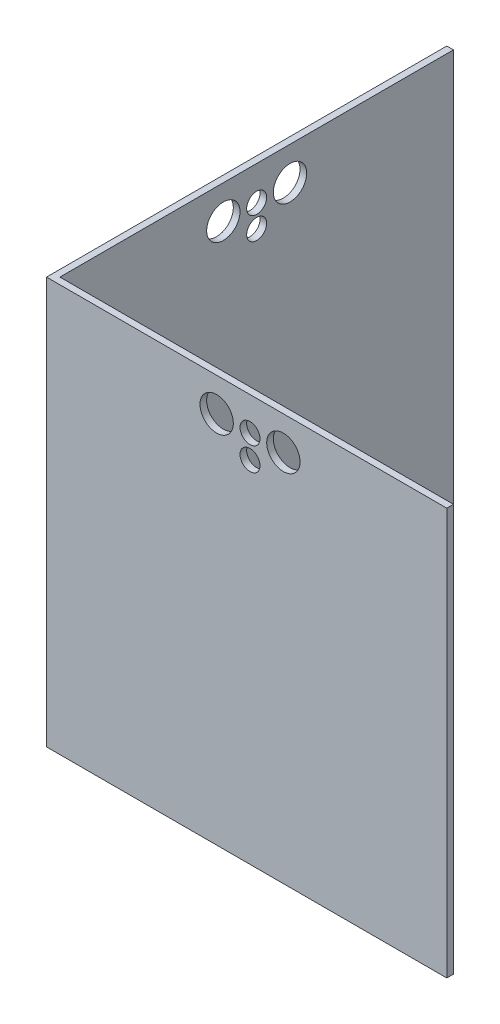
ISO-10303-21;
HEADER;
FILE_DESCRIPTION(('STEP AP214'),'2;1');
FILE_NAME('part.step','',(''),(''),'','','');
FILE_SCHEMA(('AUTOMOTIVE_DESIGN { 1 0 10303 214 1 1 1 1 }'));
ENDSEC;
DATA;
#1=APPLICATION_CONTEXT('core data for automotive mechanical design processes');
#2=APPLICATION_PROTOCOL_DEFINITION('international standard','automotive_design',2000,#1);
#3=PRODUCT_CONTEXT('',#1,'mechanical');
#4=PRODUCT('Part','Part','',(#3));
#5=PRODUCT_RELATED_PRODUCT_CATEGORY('part','',(#4));
#6=PRODUCT_DEFINITION_FORMATION('','',#4);
#7=PRODUCT_DEFINITION_CONTEXT('part definition',#1,'design');
#8=PRODUCT_DEFINITION('design','',#6,#7);
#9=PRODUCT_DEFINITION_SHAPE('','',#8);
#10=(LENGTH_UNIT() NAMED_UNIT(*) SI_UNIT(.MILLI.,.METRE.));
#11=(NAMED_UNIT(*) PLANE_ANGLE_UNIT() SI_UNIT($,.RADIAN.));
#12=(NAMED_UNIT(*) SI_UNIT($,.STERADIAN.) SOLID_ANGLE_UNIT());
#13=UNCERTAINTY_MEASURE_WITH_UNIT(LENGTH_MEASURE(1.E-05),#10,'distance_accuracy_value','');
#14=(GEOMETRIC_REPRESENTATION_CONTEXT(3) GLOBAL_UNCERTAINTY_ASSIGNED_CONTEXT((#13)) GLOBAL_UNIT_ASSIGNED_CONTEXT((#10,
#11,#12)) REPRESENTATION_CONTEXT('',''));
#15=CARTESIAN_POINT('',(0.,0.,0.));
#16=DIRECTION('',(0.,0.,1.));
#17=DIRECTION('',(1.,0.,0.));
#18=AXIS2_PLACEMENT_3D('',#15,#16,#17);
#19=CARTESIAN_POINT('',(-71.6450963275028,2.,-99.585522077645));
#20=DIRECTION('',(0.,0.,1.));
#21=DIRECTION('',(1.,0.,0.));
#22=AXIS2_PLACEMENT_3D('',#19,#20,#21);
#23=PLANE('',#22);
#24=DIRECTION('',(-1.,0.,0.));
#25=VECTOR('',#24,1.);
#26=CARTESIAN_POINT('',(-71.6450963275028,0.,-99.585522077645));
#27=LINE('',#26,#25);
#28=CARTESIAN_POINT('',(-69.6450963275028,0.,-99.585522077645));
#29=VERTEX_POINT('',#28);
#30=CARTESIAN_POINT('',(-71.6450963275028,0.,-99.585522077645));
#31=VERTEX_POINT('',#30);
#32=EDGE_CURVE('E125',#29,#31,#27,.T.);
#33=ORIENTED_EDGE('',*,*,#32,.T.);
#34=DIRECTION('',(0.,-1.,0.));
#35=VECTOR('',#34,1.);
#36=CARTESIAN_POINT('',(-71.6450963275028,2.,-99.585522077645));
#37=LINE('',#36,#35);
#38=CARTESIAN_POINT('',(-71.6450963275028,122.,-99.585522077645));
#39=VERTEX_POINT('',#38);
#40=EDGE_CURVE('E11',#39,#31,#37,.T.);
#41=ORIENTED_EDGE('',*,*,#40,.F.);
#42=DIRECTION('',(-1.,0.,0.));
#43=VECTOR('',#42,1.);
#44=CARTESIAN_POINT('',(-71.6450963275028,122.,-99.585522077645));
#45=LINE('',#44,#43);
#46=CARTESIAN_POINT('',(-69.6450963275028,122.,-99.585522077645));
#47=VERTEX_POINT('',#46);
#48=EDGE_CURVE('E123',#47,#39,#45,.T.);
#49=ORIENTED_EDGE('',*,*,#48,.F.);
#50=DIRECTION('',(0.,-1.,0.));
#51=VECTOR('',#50,1.);
#52=CARTESIAN_POINT('',(-69.6450963275028,122.,-99.585522077645));
#53=LINE('',#52,#51);
#54=CARTESIAN_POINT('',(-69.6450963275028,2.,-99.585522077645));
#55=VERTEX_POINT('',#54);
#56=EDGE_CURVE('E154',#47,#55,#53,.T.);
#57=ORIENTED_EDGE('',*,*,#56,.T.);
#58=DIRECTION('',(0.,-1.,0.));
#59=VECTOR('',#58,1.);
#60=CARTESIAN_POINT('',(-69.6450963275028,2.,-99.585522077645));
#61=LINE('',#60,#59);
#62=EDGE_CURVE('E169',#55,#29,#61,.T.);
#63=ORIENTED_EDGE('',*,*,#62,.T.);
#64=EDGE_LOOP('',(#33,#41,#49,#57,#63));
#65=FACE_BOUND('',#64,.T.);
#66=ADVANCED_FACE('F41',(#65),#23,.F.);
#67=CARTESIAN_POINT('',(-71.6450963275028,2.,-99.585522077645));
#68=DIRECTION('',(1.,0.,0.));
#69=DIRECTION('',(0.,0.,-1.));
#70=AXIS2_PLACEMENT_3D('',#67,#68,#69);
#71=PLANE('',#70);
#72=CARTESIAN_POINT('',(-71.6450963275028,112.,-30.585522077645));
#73=DIRECTION('',(1.,0.,0.));
#74=DIRECTION('',(0.,0.,-1.));
#75=AXIS2_PLACEMENT_3D('',#72,#73,#74);
#76=CIRCLE('',#75,5.);
#77=CARTESIAN_POINT('',(-71.6450963275028,112.,-35.585522077645));
#78=VERTEX_POINT('',#77);
#79=EDGE_CURVE('E413',#78,#78,#76,.T.);
#80=ORIENTED_EDGE('',*,*,#79,.T.);
#81=EDGE_LOOP('',(#80));
#82=FACE_BOUND('',#81,.T.);
#83=CARTESIAN_POINT('',(-71.6450963275028,112.,-50.585522077645));
#84=DIRECTION('',(1.,0.,0.));
#85=DIRECTION('',(0.,0.,-1.));
#86=AXIS2_PLACEMENT_3D('',#83,#84,#85);
#87=CIRCLE('',#86,5.);
#88=CARTESIAN_POINT('',(-71.6450963275028,112.,-55.585522077645));
#89=VERTEX_POINT('',#88);
#90=EDGE_CURVE('E406',#89,#89,#87,.T.);
#91=ORIENTED_EDGE('',*,*,#90,.T.);
#92=EDGE_LOOP('',(#91));
#93=FACE_BOUND('',#92,.T.);
#94=CARTESIAN_POINT('',(-71.6450963275028,104.992052500628,-40.585522077645));
#95=DIRECTION('',(1.,0.,0.));
#96=DIRECTION('',(0.,0.,-1.));
#97=AXIS2_PLACEMENT_3D('',#94,#95,#96);
#98=CIRCLE('',#97,3.);
#99=CARTESIAN_POINT('',(-71.6450963275028,104.992052500628,-43.585522077645));
#100=VERTEX_POINT('',#99);
#101=EDGE_CURVE('E400',#100,#100,#98,.T.);
#102=ORIENTED_EDGE('',*,*,#101,.T.);
#103=EDGE_LOOP('',(#102));
#104=FACE_BOUND('',#103,.T.);
#105=CARTESIAN_POINT('',(-71.6450963275028,111.785381459401,-40.585522077645));
#106=DIRECTION('',(1.,0.,0.));
#107=DIRECTION('',(0.,0.,-1.));
#108=AXIS2_PLACEMENT_3D('',#105,#106,#107);
#109=CIRCLE('',#108,3.);
#110=CARTESIAN_POINT('',(-71.6450963275028,111.785381459401,-43.585522077645));
#111=VERTEX_POINT('',#110);
#112=EDGE_CURVE('E420',#111,#111,#109,.T.);
#113=ORIENTED_EDGE('',*,*,#112,.T.);
#114=EDGE_LOOP('',(#113));
#115=FACE_BOUND('',#114,.T.);
#116=DIRECTION('',(0.,0.,1.));
#117=VECTOR('',#116,1.);
#118=CARTESIAN_POINT('',(-71.6450963275028,0.,-99.585522077645));
#119=LINE('',#118,#117);
#120=CARTESIAN_POINT('',(-71.6450963275028,0.,20.414477922355));
#121=VERTEX_POINT('',#120);
#122=EDGE_CURVE('E171',#31,#121,#119,.T.);
#123=ORIENTED_EDGE('',*,*,#122,.T.);
#124=DIRECTION('',(0.,-1.,0.));
#125=VECTOR('',#124,1.);
#126=CARTESIAN_POINT('',(-71.6450963275028,2.,20.414477922355));
#127=LINE('',#126,#125);
#128=CARTESIAN_POINT('',(-71.6450963275028,122.,20.414477922355));
#129=VERTEX_POINT('',#128);
#130=EDGE_CURVE('E49',#129,#121,#127,.T.);
#131=ORIENTED_EDGE('',*,*,#130,.F.);
#132=DIRECTION('',(0.,0.,1.));
#133=VECTOR('',#132,1.);
#134=CARTESIAN_POINT('',(-71.6450963275028,122.,20.414477922355));
#135=LINE('',#134,#133);
#136=EDGE_CURVE('E128',#39,#129,#135,.T.);
#137=ORIENTED_EDGE('',*,*,#136,.F.);
#138=ORIENTED_EDGE('',*,*,#40,.T.);
#139=EDGE_LOOP('',(#123,#131,#137,#138));
#140=FACE_BOUND('',#139,.T.);
#141=ADVANCED_FACE('F129',(#82,#93,#104,#115,#140),#71,.F.);
#142=CARTESIAN_POINT('',(-71.6450963275028,2.,20.414477922355));
#143=DIRECTION('',(0.,0.,-1.));
#144=DIRECTION('',(-1.,0.,0.));
#145=AXIS2_PLACEMENT_3D('',#142,#143,#144);
#146=PLANE('',#145);
#147=CARTESIAN_POINT('',(-10.6450963275028,105.,20.414477922355));
#148=DIRECTION('',(0.,0.,-1.));
#149=DIRECTION('',(-1.,0.,0.));
#150=AXIS2_PLACEMENT_3D('',#147,#148,#149);
#151=CIRCLE('',#150,3.);
#152=CARTESIAN_POINT('',(-13.6450963275028,105.,20.414477922355));
#153=VERTEX_POINT('',#152);
#154=EDGE_CURVE('E395',#153,#153,#151,.T.);
#155=ORIENTED_EDGE('',*,*,#154,.T.);
#156=EDGE_LOOP('',(#155));
#157=FACE_BOUND('',#156,.T.);
#158=CARTESIAN_POINT('',(-0.64509632750281,112.,20.414477922355));
#159=DIRECTION('',(0.,0.,-1.));
#160=DIRECTION('',(-1.,0.,0.));
#161=AXIS2_PLACEMENT_3D('',#158,#159,#160);
#162=CIRCLE('',#161,5.);
#163=CARTESIAN_POINT('',(-5.64509632750281,112.,20.414477922355));
#164=VERTEX_POINT('',#163);
#165=EDGE_CURVE('E155',#164,#164,#162,.T.);
#166=ORIENTED_EDGE('',*,*,#165,.T.);
#167=EDGE_LOOP('',(#166));
#168=FACE_BOUND('',#167,.T.);
#169=CARTESIAN_POINT('',(-20.6450963275028,112.,20.414477922355));
#170=DIRECTION('',(0.,0.,-1.));
#171=DIRECTION('',(-1.,0.,0.));
#172=AXIS2_PLACEMENT_3D('',#169,#170,#171);
#173=CIRCLE('',#172,5.);
#174=CARTESIAN_POINT('',(-25.6450963275028,112.,20.414477922355));
#175=VERTEX_POINT('',#174);
#176=EDGE_CURVE('E433',#175,#175,#173,.T.);
#177=ORIENTED_EDGE('',*,*,#176,.T.);
#178=EDGE_LOOP('',(#177));
#179=FACE_BOUND('',#178,.T.);
#180=CARTESIAN_POINT('',(-10.6450963275028,112.,20.414477922355));
#181=DIRECTION('',(0.,0.,-1.));
#182=DIRECTION('',(-1.,0.,0.));
#183=AXIS2_PLACEMENT_3D('',#180,#181,#182);
#184=CIRCLE('',#183,3.);
#185=CARTESIAN_POINT('',(-13.6450963275028,112.,20.414477922355));
#186=VERTEX_POINT('',#185);
#187=EDGE_CURVE('E145',#186,#186,#184,.T.);
#188=ORIENTED_EDGE('',*,*,#187,.T.);
#189=EDGE_LOOP('',(#188));
#190=FACE_BOUND('',#189,.T.);
#191=DIRECTION('',(1.,0.,0.));
#192=VECTOR('',#191,1.);
#193=CARTESIAN_POINT('',(-71.6450963275028,0.,20.414477922355));
#194=LINE('',#193,#192);
#195=CARTESIAN_POINT('',(48.3549036724972,0.,20.414477922355));
#196=VERTEX_POINT('',#195);
#197=EDGE_CURVE('E173',#121,#196,#194,.T.);
#198=ORIENTED_EDGE('',*,*,#197,.T.);
#199=DIRECTION('',(0.,-1.,0.));
#200=VECTOR('',#199,1.);
#201=CARTESIAN_POINT('',(48.3549036724972,2.,20.414477922355));
#202=LINE('',#201,#200);
#203=CARTESIAN_POINT('',(48.3549036724972,122.,20.414477922355));
#204=VERTEX_POINT('',#203);
#205=EDGE_CURVE('E189',#204,#196,#202,.T.);
#206=ORIENTED_EDGE('',*,*,#205,.F.);
#207=DIRECTION('',(1.,0.,0.));
#208=VECTOR('',#207,1.);
#209=CARTESIAN_POINT('',(48.3549036724972,122.,20.414477922355));
#210=LINE('',#209,#208);
#211=EDGE_CURVE('E134',#129,#204,#210,.T.);
#212=ORIENTED_EDGE('',*,*,#211,.F.);
#213=ORIENTED_EDGE('',*,*,#130,.T.);
#214=EDGE_LOOP('',(#198,#206,#212,#213));
#215=FACE_BOUND('',#214,.T.);
#216=ADVANCED_FACE('F193',(#157,#168,#179,#190,#215),#146,.F.);
#217=CARTESIAN_POINT('',(48.3549036724972,2.,20.414477922355));
#218=DIRECTION('',(-1.,0.,0.));
#219=DIRECTION('',(0.,0.,1.));
#220=AXIS2_PLACEMENT_3D('',#217,#218,#219);
#221=PLANE('',#220);
#222=DIRECTION('',(0.,0.,-1.));
#223=VECTOR('',#222,1.);
#224=CARTESIAN_POINT('',(48.3549036724972,0.,20.414477922355));
#225=LINE('',#224,#223);
#226=CARTESIAN_POINT('',(48.3549036724972,0.,18.414477922355));
#227=VERTEX_POINT('',#226);
#228=EDGE_CURVE('E175',#196,#227,#225,.T.);
#229=ORIENTED_EDGE('',*,*,#228,.T.);
#230=DIRECTION('',(0.,-1.,0.));
#231=VECTOR('',#230,1.);
#232=CARTESIAN_POINT('',(48.3549036724972,2.,18.414477922355));
#233=LINE('',#232,#231);
#234=CARTESIAN_POINT('',(48.3549036724972,2.,18.414477922355));
#235=VERTEX_POINT('',#234);
#236=EDGE_CURVE('E186',#235,#227,#233,.T.);
#237=ORIENTED_EDGE('',*,*,#236,.F.);
#238=DIRECTION('',(0.,-1.,0.));
#239=VECTOR('',#238,1.);
#240=CARTESIAN_POINT('',(48.3549036724972,122.,18.414477922355));
#241=LINE('',#240,#239);
#242=CARTESIAN_POINT('',(48.3549036724972,122.,18.414477922355));
#243=VERTEX_POINT('',#242);
#244=EDGE_CURVE('E161',#243,#235,#241,.T.);
#245=ORIENTED_EDGE('',*,*,#244,.F.);
#246=DIRECTION('',(0.,0.,-1.));
#247=VECTOR('',#246,1.);
#248=CARTESIAN_POINT('',(48.3549036724972,122.,18.414477922355));
#249=LINE('',#248,#247);
#250=EDGE_CURVE('E149',#204,#243,#249,.T.);
#251=ORIENTED_EDGE('',*,*,#250,.F.);
#252=ORIENTED_EDGE('',*,*,#205,.T.);
#253=EDGE_LOOP('',(#229,#237,#245,#251,#252));
#254=FACE_BOUND('',#253,.T.);
#255=ADVANCED_FACE('F199',(#254),#221,.F.);
#256=CARTESIAN_POINT('',(-1.80626156267099,2.,-31.7466873128132));
#257=DIRECTION('',(-0.707106781186547,0.,0.707106781186548));
#258=DIRECTION('',(0.707106781186548,0.,0.707106781186547));
#259=AXIS2_PLACEMENT_3D('',#256,#257,#258);
#260=PLANE('',#259);
#261=DIRECTION('',(-0.707106781186548,0.,-0.707106781186548));
#262=VECTOR('',#261,1.);
#263=CARTESIAN_POINT('',(-1.80626156267099,0.,-31.7466873128132));
#264=LINE('',#263,#262);
#265=CARTESIAN_POINT('',(-1.80626156267099,0.,-31.7466873128132));
#266=VERTEX_POINT('',#265);
#267=EDGE_CURVE('E177',#227,#266,#264,.T.);
#268=ORIENTED_EDGE('',*,*,#267,.T.);
#269=DIRECTION('',(0.,-1.,0.));
#270=VECTOR('',#269,1.);
#271=CARTESIAN_POINT('',(-1.80626156267099,2.,-31.7466873128132));
#272=LINE('',#271,#270);
#273=CARTESIAN_POINT('',(-1.80626156267099,2.,-31.7466873128132));
#274=VERTEX_POINT('',#273);
#275=EDGE_CURVE('E184',#274,#266,#272,.T.);
#276=ORIENTED_EDGE('',*,*,#275,.F.);
#277=DIRECTION('',(-0.707106781186548,0.,-0.707106781186548));
#278=VECTOR('',#277,1.);
#279=CARTESIAN_POINT('',(-1.80626156267099,2.,-31.7466873128132));
#280=LINE('',#279,#278);
#281=EDGE_CURVE('E164',#235,#274,#280,.T.);
#282=ORIENTED_EDGE('',*,*,#281,.F.);
#283=ORIENTED_EDGE('',*,*,#236,.T.);
#284=EDGE_LOOP('',(#268,#276,#282,#283));
#285=FACE_BOUND('',#284,.T.);
#286=ADVANCED_FACE('F204',(#285),#260,.F.);
#287=CARTESIAN_POINT('',(-10.6450963275028,2.,-40.5855220776451));
#288=DIRECTION('',(0.,-1.,0.));
#289=DIRECTION('',(0.,0.,-1.));
#290=AXIS2_PLACEMENT_3D('',#287,#288,#289);
#291=CYLINDRICAL_SURFACE('',#290,12.5);
#292=CARTESIAN_POINT('',(-10.6450963275028,0.,-40.5855220776451));
#293=DIRECTION('',(0.,-1.,0.));
#294=DIRECTION('',(0.,0.,1.));
#295=AXIS2_PLACEMENT_3D('',#292,#293,#294);
#296=CIRCLE('',#295,12.5);
#297=CARTESIAN_POINT('',(-19.4839310923347,0.,-49.4243568424769));
#298=VERTEX_POINT('',#297);
#299=EDGE_CURVE('E84',#266,#298,#296,.T.);
#300=ORIENTED_EDGE('',*,*,#299,.T.);
#301=DIRECTION('',(0.,-1.,0.));
#302=VECTOR('',#301,1.);
#303=CARTESIAN_POINT('',(-19.4839310923347,2.,-49.4243568424769));
#304=LINE('',#303,#302);
#305=CARTESIAN_POINT('',(-19.4839310923347,2.,-49.4243568424769));
#306=VERTEX_POINT('',#305);
#307=EDGE_CURVE('E182',#306,#298,#304,.T.);
#308=ORIENTED_EDGE('',*,*,#307,.F.);
#309=CARTESIAN_POINT('',(-10.6450963275028,2.,-40.5855220776451));
#310=DIRECTION('',(0.,-1.,0.));
#311=DIRECTION('',(0.,0.,1.));
#312=AXIS2_PLACEMENT_3D('',#309,#310,#311);
#313=CIRCLE('',#312,12.5);
#314=EDGE_CURVE('E166',#274,#306,#313,.T.);
#315=ORIENTED_EDGE('',*,*,#314,.F.);
#316=ORIENTED_EDGE('',*,*,#275,.T.);
#317=EDGE_LOOP('',(#300,#308,#315,#316));
#318=FACE_BOUND('',#317,.T.);
#319=ADVANCED_FACE('F214',(#318),#291,.F.);
#320=CARTESIAN_POINT('',(-69.6450963275028,2.,-99.585522077645));
#321=DIRECTION('',(-0.707106781186547,0.,0.707106781186548));
#322=DIRECTION('',(0.707106781186548,0.,0.707106781186547));
#323=AXIS2_PLACEMENT_3D('',#320,#321,#322);
#324=PLANE('',#323);
#325=DIRECTION('',(-0.707106781186548,0.,-0.707106781186547));
#326=VECTOR('',#325,1.);
#327=CARTESIAN_POINT('',(-69.6450963275028,0.,-99.585522077645));
#328=LINE('',#327,#326);
#329=EDGE_CURVE('E90',#298,#29,#328,.T.);
#330=ORIENTED_EDGE('',*,*,#329,.T.);
#331=ORIENTED_EDGE('',*,*,#62,.F.);
#332=DIRECTION('',(-0.707106781186548,0.,-0.707106781186547));
#333=VECTOR('',#332,1.);
#334=CARTESIAN_POINT('',(-69.6450963275028,2.,-99.585522077645));
#335=LINE('',#334,#333);
#336=EDGE_CURVE('E57',#306,#55,#335,.T.);
#337=ORIENTED_EDGE('',*,*,#336,.F.);
#338=ORIENTED_EDGE('',*,*,#307,.T.);
#339=EDGE_LOOP('',(#330,#331,#337,#338));
#340=FACE_BOUND('',#339,.T.);
#341=ADVANCED_FACE('F213',(#340),#324,.F.);
#342=CARTESIAN_POINT('',(-10.6450963275028,2.,-40.5855220776451));
#343=DIRECTION('',(0.,1.,0.));
#344=DIRECTION('',(0.,0.,1.));
#345=AXIS2_PLACEMENT_3D('',#342,#343,#344);
#346=PLANE('',#345);
#347=DIRECTION('',(0.,0.,-1.));
#348=VECTOR('',#347,1.);
#349=CARTESIAN_POINT('',(-69.6450963275028,2.,-99.585522077645));
#350=LINE('',#349,#348);
#351=CARTESIAN_POINT('',(-69.6450963275028,2.,18.414477922355));
#352=VERTEX_POINT('',#351);
#353=EDGE_CURVE('E140',#352,#55,#350,.T.);
#354=ORIENTED_EDGE('',*,*,#353,.F.);
#355=DIRECTION('',(-1.,0.,0.));
#356=VECTOR('',#355,1.);
#357=CARTESIAN_POINT('',(-69.6450963275028,2.,18.414477922355));
#358=LINE('',#357,#356);
#359=EDGE_CURVE('E96',#235,#352,#358,.T.);
#360=ORIENTED_EDGE('',*,*,#359,.F.);
#361=ORIENTED_EDGE('',*,*,#281,.T.);
#362=ORIENTED_EDGE('',*,*,#314,.T.);
#363=ORIENTED_EDGE('',*,*,#336,.T.);
#364=EDGE_LOOP('',(#354,#360,#361,#362,#363));
#365=FACE_BOUND('',#364,.T.);
#366=ADVANCED_FACE('F215',(#365),#346,.T.);
#367=CARTESIAN_POINT('',(-10.6450963275028,0.,-40.5855220776451));
#368=DIRECTION('',(0.,1.,0.));
#369=DIRECTION('',(0.,0.,1.));
#370=AXIS2_PLACEMENT_3D('',#367,#368,#369);
#371=PLANE('',#370);
#372=ORIENTED_EDGE('',*,*,#32,.F.);
#373=ORIENTED_EDGE('',*,*,#329,.F.);
#374=ORIENTED_EDGE('',*,*,#299,.F.);
#375=ORIENTED_EDGE('',*,*,#267,.F.);
#376=ORIENTED_EDGE('',*,*,#228,.F.);
#377=ORIENTED_EDGE('',*,*,#197,.F.);
#378=ORIENTED_EDGE('',*,*,#122,.F.);
#379=EDGE_LOOP('',(#372,#373,#374,#375,#376,#377,#378));
#380=FACE_BOUND('',#379,.T.);
#381=ADVANCED_FACE('F196',(#380),#371,.F.);
#382=CARTESIAN_POINT('',(-69.6450963275028,122.,18.414477922355));
#383=DIRECTION('',(0.,0.,1.));
#384=DIRECTION('',(1.,0.,0.));
#385=AXIS2_PLACEMENT_3D('',#382,#383,#384);
#386=PLANE('',#385);
#387=CARTESIAN_POINT('',(-10.6450963275028,105.,18.414477922355));
#388=DIRECTION('',(0.,0.,-1.));
#389=DIRECTION('',(-1.,0.,0.));
#390=AXIS2_PLACEMENT_3D('',#387,#388,#389);
#391=CIRCLE('',#390,3.);
#392=CARTESIAN_POINT('',(-13.6450963275028,105.,18.414477922355));
#393=VERTEX_POINT('',#392);
#394=EDGE_CURVE('E398',#393,#393,#391,.T.);
#395=ORIENTED_EDGE('',*,*,#394,.F.);
#396=EDGE_LOOP('',(#395));
#397=FACE_BOUND('',#396,.T.);
#398=CARTESIAN_POINT('',(-0.64509632750281,112.,18.414477922355));
#399=DIRECTION('',(0.,0.,-1.));
#400=DIRECTION('',(-1.,0.,0.));
#401=AXIS2_PLACEMENT_3D('',#398,#399,#400);
#402=CIRCLE('',#401,5.);
#403=CARTESIAN_POINT('',(-5.64509632750281,112.,18.414477922355));
#404=VERTEX_POINT('',#403);
#405=EDGE_CURVE('E427',#404,#404,#402,.T.);
#406=ORIENTED_EDGE('',*,*,#405,.F.);
#407=EDGE_LOOP('',(#406));
#408=FACE_BOUND('',#407,.T.);
#409=CARTESIAN_POINT('',(-20.6450963275028,112.,18.414477922355));
#410=DIRECTION('',(0.,0.,-1.));
#411=DIRECTION('',(-1.,0.,0.));
#412=AXIS2_PLACEMENT_3D('',#409,#410,#411);
#413=CIRCLE('',#412,5.);
#414=CARTESIAN_POINT('',(-25.6450963275028,112.,18.414477922355));
#415=VERTEX_POINT('',#414);
#416=EDGE_CURVE('E430',#415,#415,#413,.T.);
#417=ORIENTED_EDGE('',*,*,#416,.F.);
#418=EDGE_LOOP('',(#417));
#419=FACE_BOUND('',#418,.T.);
#420=CARTESIAN_POINT('',(-10.6450963275028,112.,18.414477922355));
#421=DIRECTION('',(0.,0.,-1.));
#422=DIRECTION('',(-1.,0.,0.));
#423=AXIS2_PLACEMENT_3D('',#420,#421,#422);
#424=CIRCLE('',#423,3.);
#425=CARTESIAN_POINT('',(-13.6450963275028,112.,18.414477922355));
#426=VERTEX_POINT('',#425);
#427=EDGE_CURVE('E435',#426,#426,#424,.T.);
#428=ORIENTED_EDGE('',*,*,#427,.F.);
#429=EDGE_LOOP('',(#428));
#430=FACE_BOUND('',#429,.T.);
#431=ORIENTED_EDGE('',*,*,#359,.T.);
#432=DIRECTION('',(0.,-1.,0.));
#433=VECTOR('',#432,1.);
#434=CARTESIAN_POINT('',(-69.6450963275028,122.,18.414477922355));
#435=LINE('',#434,#433);
#436=CARTESIAN_POINT('',(-69.6450963275028,122.,18.414477922355));
#437=VERTEX_POINT('',#436);
#438=EDGE_CURVE('E158',#437,#352,#435,.T.);
#439=ORIENTED_EDGE('',*,*,#438,.F.);
#440=DIRECTION('',(-1.,0.,0.));
#441=VECTOR('',#440,1.);
#442=CARTESIAN_POINT('',(-69.6450963275028,122.,18.414477922355));
#443=LINE('',#442,#441);
#444=EDGE_CURVE('E151',#243,#437,#443,.T.);
#445=ORIENTED_EDGE('',*,*,#444,.F.);
#446=ORIENTED_EDGE('',*,*,#244,.T.);
#447=EDGE_LOOP('',(#431,#439,#445,#446));
#448=FACE_BOUND('',#447,.T.);
#449=ADVANCED_FACE('F209',(#397,#408,#419,#430,#448),#386,.F.);
#450=CARTESIAN_POINT('',(-69.6450963275028,122.,-99.585522077645));
#451=DIRECTION('',(-1.,0.,0.));
#452=DIRECTION('',(0.,0.,1.));
#453=AXIS2_PLACEMENT_3D('',#450,#451,#452);
#454=PLANE('',#453);
#455=CARTESIAN_POINT('',(-69.6450963275028,112.,-30.585522077645));
#456=DIRECTION('',(1.,0.,0.));
#457=DIRECTION('',(0.,0.,-1.));
#458=AXIS2_PLACEMENT_3D('',#455,#456,#457);
#459=CIRCLE('',#458,5.);
#460=CARTESIAN_POINT('',(-69.6450963275028,112.,-35.585522077645));
#461=VERTEX_POINT('',#460);
#462=EDGE_CURVE('E409',#461,#461,#459,.T.);
#463=ORIENTED_EDGE('',*,*,#462,.F.);
#464=EDGE_LOOP('',(#463));
#465=FACE_BOUND('',#464,.T.);
#466=CARTESIAN_POINT('',(-69.6450963275028,112.,-50.585522077645));
#467=DIRECTION('',(1.,0.,0.));
#468=DIRECTION('',(0.,0.,-1.));
#469=AXIS2_PLACEMENT_3D('',#466,#467,#468);
#470=CIRCLE('',#469,5.);
#471=CARTESIAN_POINT('',(-69.6450963275028,112.,-55.585522077645));
#472=VERTEX_POINT('',#471);
#473=EDGE_CURVE('E415',#472,#472,#470,.T.);
#474=ORIENTED_EDGE('',*,*,#473,.F.);
#475=EDGE_LOOP('',(#474));
#476=FACE_BOUND('',#475,.T.);
#477=CARTESIAN_POINT('',(-69.6450963275028,104.992052500628,-40.585522077645));
#478=DIRECTION('',(1.,0.,0.));
#479=DIRECTION('',(0.,0.,-1.));
#480=AXIS2_PLACEMENT_3D('',#477,#478,#479);
#481=CIRCLE('',#480,3.);
#482=CARTESIAN_POINT('',(-69.6450963275028,104.992052500628,-43.585522077645));
#483=VERTEX_POINT('',#482);
#484=EDGE_CURVE('E403',#483,#483,#481,.T.);
#485=ORIENTED_EDGE('',*,*,#484,.F.);
#486=EDGE_LOOP('',(#485));
#487=FACE_BOUND('',#486,.T.);
#488=CARTESIAN_POINT('',(-69.6450963275028,111.785381459401,-40.585522077645));
#489=DIRECTION('',(1.,0.,0.));
#490=DIRECTION('',(0.,0.,-1.));
#491=AXIS2_PLACEMENT_3D('',#488,#489,#490);
#492=CIRCLE('',#491,3.);
#493=CARTESIAN_POINT('',(-69.6450963275028,111.785381459401,-43.585522077645));
#494=VERTEX_POINT('',#493);
#495=EDGE_CURVE('E412',#494,#494,#492,.T.);
#496=ORIENTED_EDGE('',*,*,#495,.F.);
#497=EDGE_LOOP('',(#496));
#498=FACE_BOUND('',#497,.T.);
#499=ORIENTED_EDGE('',*,*,#353,.T.);
#500=ORIENTED_EDGE('',*,*,#56,.F.);
#501=DIRECTION('',(0.,0.,-1.));
#502=VECTOR('',#501,1.);
#503=CARTESIAN_POINT('',(-69.6450963275028,122.,-99.585522077645));
#504=LINE('',#503,#502);
#505=EDGE_CURVE('E138',#437,#47,#504,.T.);
#506=ORIENTED_EDGE('',*,*,#505,.F.);
#507=ORIENTED_EDGE('',*,*,#438,.T.);
#508=EDGE_LOOP('',(#499,#500,#506,#507));
#509=FACE_BOUND('',#508,.T.);
#510=ADVANCED_FACE('F212',(#465,#476,#487,#498,#509),#454,.F.);
#511=CARTESIAN_POINT('',(0.,122.,0.));
#512=DIRECTION('',(0.,-1.,0.));
#513=DIRECTION('',(0.,0.,-1.));
#514=AXIS2_PLACEMENT_3D('',#511,#512,#513);
#515=PLANE('',#514);
#516=ORIENTED_EDGE('',*,*,#48,.T.);
#517=ORIENTED_EDGE('',*,*,#136,.T.);
#518=ORIENTED_EDGE('',*,*,#211,.T.);
#519=ORIENTED_EDGE('',*,*,#250,.T.);
#520=ORIENTED_EDGE('',*,*,#444,.T.);
#521=ORIENTED_EDGE('',*,*,#505,.T.);
#522=EDGE_LOOP('',(#516,#517,#518,#519,#520,#521));
#523=FACE_BOUND('',#522,.T.);
#524=ADVANCED_FACE('F136',(#523),#515,.F.);
#525=CARTESIAN_POINT('',(-10.6450963275028,112.,20.414477922355));
#526=DIRECTION('',(0.,0.,-1.));
#527=DIRECTION('',(-1.,0.,0.));
#528=AXIS2_PLACEMENT_3D('',#525,#526,#527);
#529=CYLINDRICAL_SURFACE('',#528,3.);
#530=ORIENTED_EDGE('',*,*,#187,.F.);
#531=EDGE_LOOP('',(#530));
#532=FACE_BOUND('',#531,.T.);
#533=ORIENTED_EDGE('',*,*,#427,.T.);
#534=EDGE_LOOP('',(#533));
#535=FACE_BOUND('',#534,.T.);
#536=ADVANCED_FACE('F314',(#532,#535),#529,.F.);
#537=CARTESIAN_POINT('',(-20.6450963275028,112.,20.414477922355));
#538=DIRECTION('',(0.,0.,-1.));
#539=DIRECTION('',(-1.,0.,0.));
#540=AXIS2_PLACEMENT_3D('',#537,#538,#539);
#541=CYLINDRICAL_SURFACE('',#540,5.);
#542=ORIENTED_EDGE('',*,*,#176,.F.);
#543=EDGE_LOOP('',(#542));
#544=FACE_BOUND('',#543,.T.);
#545=ORIENTED_EDGE('',*,*,#416,.T.);
#546=EDGE_LOOP('',(#545));
#547=FACE_BOUND('',#546,.T.);
#548=ADVANCED_FACE('F323',(#544,#547),#541,.F.);
#549=CARTESIAN_POINT('',(-0.64509632750281,112.,20.414477922355));
#550=DIRECTION('',(0.,0.,-1.));
#551=DIRECTION('',(-1.,0.,0.));
#552=AXIS2_PLACEMENT_3D('',#549,#550,#551);
#553=CYLINDRICAL_SURFACE('',#552,5.);
#554=ORIENTED_EDGE('',*,*,#165,.F.);
#555=EDGE_LOOP('',(#554));
#556=FACE_BOUND('',#555,.T.);
#557=ORIENTED_EDGE('',*,*,#405,.T.);
#558=EDGE_LOOP('',(#557));
#559=FACE_BOUND('',#558,.T.);
#560=ADVANCED_FACE('F333',(#556,#559),#553,.F.);
#561=CARTESIAN_POINT('',(-71.6450963275028,111.785381459401,-40.585522077645));
#562=DIRECTION('',(1.,0.,0.));
#563=DIRECTION('',(0.,0.,-1.));
#564=AXIS2_PLACEMENT_3D('',#561,#562,#563);
#565=CYLINDRICAL_SURFACE('',#564,3.);
#566=ORIENTED_EDGE('',*,*,#112,.F.);
#567=EDGE_LOOP('',(#566));
#568=FACE_BOUND('',#567,.T.);
#569=ORIENTED_EDGE('',*,*,#495,.T.);
#570=EDGE_LOOP('',(#569));
#571=FACE_BOUND('',#570,.T.);
#572=ADVANCED_FACE('F342',(#568,#571),#565,.F.);
#573=CARTESIAN_POINT('',(-71.6450963275028,104.992052500628,-40.585522077645));
#574=DIRECTION('',(1.,0.,0.));
#575=DIRECTION('',(0.,0.,-1.));
#576=AXIS2_PLACEMENT_3D('',#573,#574,#575);
#577=CYLINDRICAL_SURFACE('',#576,3.);
#578=ORIENTED_EDGE('',*,*,#101,.F.);
#579=EDGE_LOOP('',(#578));
#580=FACE_BOUND('',#579,.T.);
#581=ORIENTED_EDGE('',*,*,#484,.T.);
#582=EDGE_LOOP('',(#581));
#583=FACE_BOUND('',#582,.T.);
#584=ADVANCED_FACE('F351',(#580,#583),#577,.F.);
#585=CARTESIAN_POINT('',(-71.6450963275028,112.,-50.585522077645));
#586=DIRECTION('',(1.,0.,0.));
#587=DIRECTION('',(0.,0.,-1.));
#588=AXIS2_PLACEMENT_3D('',#585,#586,#587);
#589=CYLINDRICAL_SURFACE('',#588,5.);
#590=ORIENTED_EDGE('',*,*,#90,.F.);
#591=EDGE_LOOP('',(#590));
#592=FACE_BOUND('',#591,.T.);
#593=ORIENTED_EDGE('',*,*,#473,.T.);
#594=EDGE_LOOP('',(#593));
#595=FACE_BOUND('',#594,.T.);
#596=ADVANCED_FACE('F361',(#592,#595),#589,.F.);
#597=CARTESIAN_POINT('',(-71.6450963275028,112.,-30.585522077645));
#598=DIRECTION('',(1.,0.,0.));
#599=DIRECTION('',(0.,0.,-1.));
#600=AXIS2_PLACEMENT_3D('',#597,#598,#599);
#601=CYLINDRICAL_SURFACE('',#600,5.);
#602=ORIENTED_EDGE('',*,*,#79,.F.);
#603=EDGE_LOOP('',(#602));
#604=FACE_BOUND('',#603,.T.);
#605=ORIENTED_EDGE('',*,*,#462,.T.);
#606=EDGE_LOOP('',(#605));
#607=FACE_BOUND('',#606,.T.);
#608=ADVANCED_FACE('F371',(#604,#607),#601,.F.);
#609=CARTESIAN_POINT('',(-10.6450963275028,105.,20.414477922355));
#610=DIRECTION('',(0.,0.,-1.));
#611=DIRECTION('',(-1.,0.,0.));
#612=AXIS2_PLACEMENT_3D('',#609,#610,#611);
#613=CYLINDRICAL_SURFACE('',#612,3.);
#614=ORIENTED_EDGE('',*,*,#154,.F.);
#615=EDGE_LOOP('',(#614));
#616=FACE_BOUND('',#615,.T.);
#617=ORIENTED_EDGE('',*,*,#394,.T.);
#618=EDGE_LOOP('',(#617));
#619=FACE_BOUND('',#618,.T.);
#620=ADVANCED_FACE('F380',(#616,#619),#613,.F.);
#621=CLOSED_SHELL('',(#66,#141,#216,#255,#286,#319,#341,#366,#381,#449,#510,#524,#536,#548,#560,
#572,#584,#596,#608,#620));
#622=MANIFOLD_SOLID_BREP('B2',#621);
#623=ADVANCED_BREP_SHAPE_REPRESENTATION('',(#18,#622),#14);
#624=SHAPE_DEFINITION_REPRESENTATION(#9,#623);
ENDSEC;
END-ISO-10303-21;
